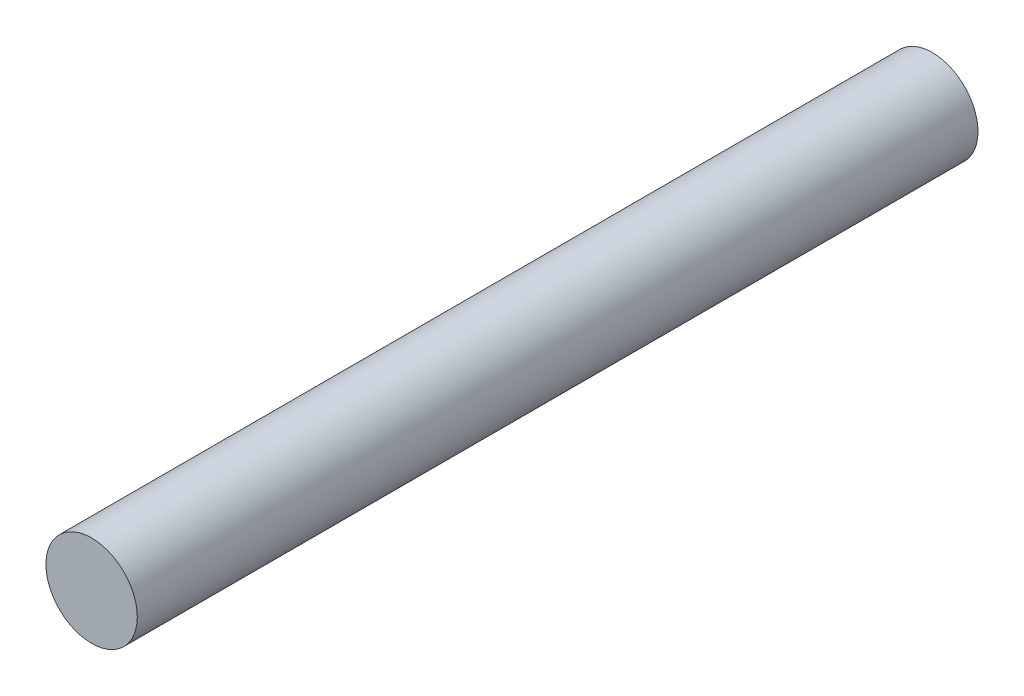
ISO-10303-21;
HEADER;
FILE_DESCRIPTION(('STEP AP214'),'2;1');
FILE_NAME('part.step','',(''),(''),'','','');
FILE_SCHEMA(('AUTOMOTIVE_DESIGN { 1 0 10303 214 1 1 1 1 }'));
ENDSEC;
DATA;
#1=APPLICATION_CONTEXT('core data for automotive mechanical design processes');
#2=APPLICATION_PROTOCOL_DEFINITION('international standard','automotive_design',2000,#1);
#3=PRODUCT_CONTEXT('',#1,'mechanical');
#4=PRODUCT('Part','Part','',(#3));
#5=PRODUCT_RELATED_PRODUCT_CATEGORY('part','',(#4));
#6=PRODUCT_DEFINITION_FORMATION('','',#4);
#7=PRODUCT_DEFINITION_CONTEXT('part definition',#1,'design');
#8=PRODUCT_DEFINITION('design','',#6,#7);
#9=PRODUCT_DEFINITION_SHAPE('','',#8);
#10=(LENGTH_UNIT() NAMED_UNIT(*) SI_UNIT(.MILLI.,.METRE.));
#11=(NAMED_UNIT(*) PLANE_ANGLE_UNIT() SI_UNIT($,.RADIAN.));
#12=(NAMED_UNIT(*) SI_UNIT($,.STERADIAN.) SOLID_ANGLE_UNIT());
#13=UNCERTAINTY_MEASURE_WITH_UNIT(LENGTH_MEASURE(1.E-05),#10,'distance_accuracy_value','');
#14=(GEOMETRIC_REPRESENTATION_CONTEXT(3) GLOBAL_UNCERTAINTY_ASSIGNED_CONTEXT((#13)) GLOBAL_UNIT_ASSIGNED_CONTEXT((#10,
#11,#12)) REPRESENTATION_CONTEXT('',''));
#15=CARTESIAN_POINT('',(0.,0.,0.));
#16=DIRECTION('',(0.,0.,1.));
#17=DIRECTION('',(1.,0.,0.));
#18=AXIS2_PLACEMENT_3D('',#15,#16,#17);
#19=CARTESIAN_POINT('',(0.,0.,46.));
#20=DIRECTION('',(0.,0.,-1.));
#21=DIRECTION('',(-1.,0.,0.));
#22=AXIS2_PLACEMENT_3D('',#19,#20,#21);
#23=CYLINDRICAL_SURFACE('',#22,2.5);
#24=CARTESIAN_POINT('',(0.,0.,46.));
#25=DIRECTION('',(0.,0.,1.));
#26=DIRECTION('',(1.,0.,0.));
#27=AXIS2_PLACEMENT_3D('',#24,#25,#26);
#28=CIRCLE('',#27,2.5);
#29=CARTESIAN_POINT('',(2.5,0.,46.));
#30=VERTEX_POINT('',#29);
#31=EDGE_CURVE('E10',#30,#30,#28,.T.);
#32=ORIENTED_EDGE('',*,*,#31,.F.);
#33=EDGE_LOOP('',(#32));
#34=FACE_BOUND('',#33,.T.);
#35=CARTESIAN_POINT('',(0.,0.,0.));
#36=DIRECTION('',(0.,0.,1.));
#37=DIRECTION('',(1.,0.,0.));
#38=AXIS2_PLACEMENT_3D('',#35,#36,#37);
#39=CIRCLE('',#38,2.5);
#40=CARTESIAN_POINT('',(2.5,0.,0.));
#41=VERTEX_POINT('',#40);
#42=EDGE_CURVE('E42',#41,#41,#39,.T.);
#43=ORIENTED_EDGE('',*,*,#42,.T.);
#44=EDGE_LOOP('',(#43));
#45=FACE_BOUND('',#44,.T.);
#46=ADVANCED_FACE('F39',(#34,#45),#23,.T.);
#47=CARTESIAN_POINT('',(0.,0.,46.));
#48=DIRECTION('',(0.,0.,1.));
#49=DIRECTION('',(1.,0.,0.));
#50=AXIS2_PLACEMENT_3D('',#47,#48,#49);
#51=PLANE('',#50);
#52=ORIENTED_EDGE('',*,*,#31,.T.);
#53=EDGE_LOOP('',(#52));
#54=FACE_BOUND('',#53,.T.);
#55=ADVANCED_FACE('F54',(#54),#51,.T.);
#56=CARTESIAN_POINT('',(0.,0.,0.));
#57=DIRECTION('',(0.,0.,1.));
#58=DIRECTION('',(1.,0.,0.));
#59=AXIS2_PLACEMENT_3D('',#56,#57,#58);
#60=PLANE('',#59);
#61=ORIENTED_EDGE('',*,*,#42,.F.);
#62=EDGE_LOOP('',(#61));
#63=FACE_BOUND('',#62,.T.);
#64=ADVANCED_FACE('F52',(#63),#60,.F.);
#65=CLOSED_SHELL('',(#46,#55,#64));
#66=MANIFOLD_SOLID_BREP('B2',#65);
#67=ADVANCED_BREP_SHAPE_REPRESENTATION('',(#18,#66),#14);
#68=SHAPE_DEFINITION_REPRESENTATION(#9,#67);
ENDSEC;
END-ISO-10303-21;
